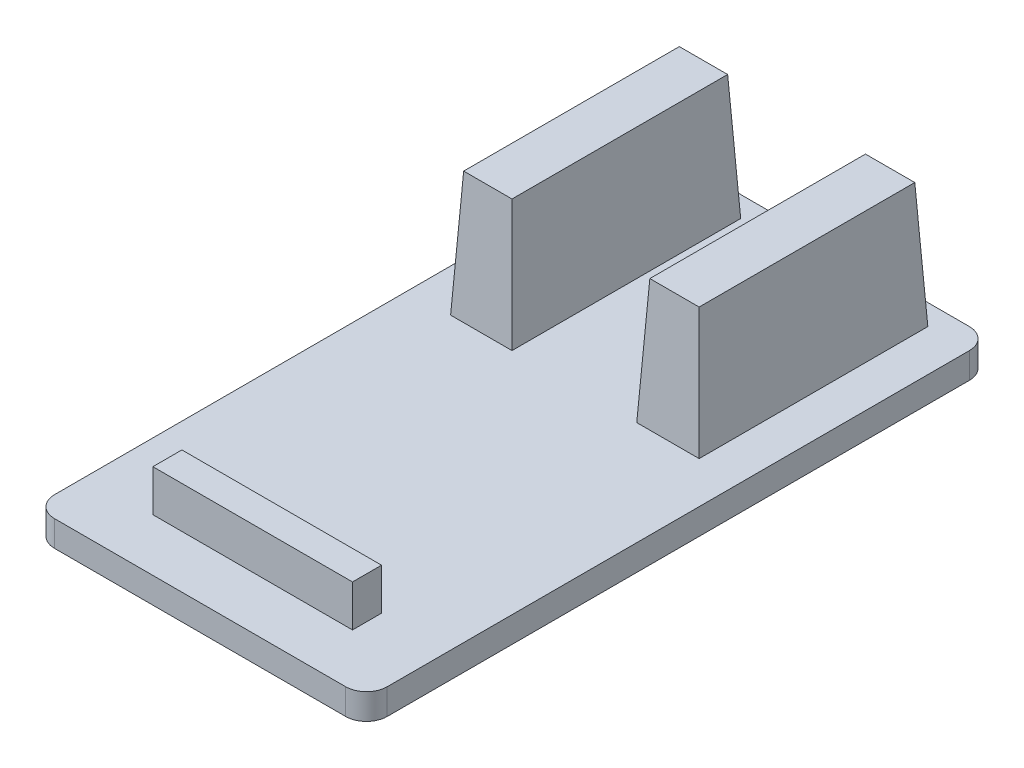
ISO-10303-21;
HEADER;
FILE_DESCRIPTION(('STEP AP214'),'2;1');
FILE_NAME('part.step','',(''),(''),'','','');
FILE_SCHEMA(('AUTOMOTIVE_DESIGN { 1 0 10303 214 1 1 1 1 }'));
ENDSEC;
DATA;
#1=APPLICATION_CONTEXT('core data for automotive mechanical design processes');
#2=APPLICATION_PROTOCOL_DEFINITION('international standard','automotive_design',2000,#1);
#3=PRODUCT_CONTEXT('',#1,'mechanical');
#4=PRODUCT('Part','Part','',(#3));
#5=PRODUCT_RELATED_PRODUCT_CATEGORY('part','',(#4));
#6=PRODUCT_DEFINITION_FORMATION('','',#4);
#7=PRODUCT_DEFINITION_CONTEXT('part definition',#1,'design');
#8=PRODUCT_DEFINITION('design','',#6,#7);
#9=PRODUCT_DEFINITION_SHAPE('','',#8);
#10=(LENGTH_UNIT() NAMED_UNIT(*) SI_UNIT(.MILLI.,.METRE.));
#11=(NAMED_UNIT(*) PLANE_ANGLE_UNIT() SI_UNIT($,.RADIAN.));
#12=(NAMED_UNIT(*) SI_UNIT($,.STERADIAN.) SOLID_ANGLE_UNIT());
#13=UNCERTAINTY_MEASURE_WITH_UNIT(LENGTH_MEASURE(1.E-05),#10,'distance_accuracy_value','');
#14=(GEOMETRIC_REPRESENTATION_CONTEXT(3) GLOBAL_UNCERTAINTY_ASSIGNED_CONTEXT((#13)) GLOBAL_UNIT_ASSIGNED_CONTEXT((#10,
#11,#12)) REPRESENTATION_CONTEXT('',''));
#15=CARTESIAN_POINT('',(0.,0.,0.));
#16=DIRECTION('',(0.,0.,1.));
#17=DIRECTION('',(1.,0.,0.));
#18=AXIS2_PLACEMENT_3D('',#15,#16,#17);
#19=CARTESIAN_POINT('',(0.,1.5748,0.));
#20=DIRECTION('',(0.,-1.,0.));
#21=DIRECTION('',(0.,0.,-1.));
#22=AXIS2_PLACEMENT_3D('',#19,#20,#21);
#23=PLANE('',#22);
#24=DIRECTION('',(0.,0.,1.));
#25=VECTOR('',#24,1.);
#26=CARTESIAN_POINT('',(2.59953863326307,1.5748,-36.83));
#27=LINE('',#26,#25);
#28=CARTESIAN_POINT('',(2.59953863326307,1.5748,-36.83));
#29=VERTEX_POINT('',#28);
#30=CARTESIAN_POINT('',(2.59953863326307,1.5748,-22.86));
#31=VERTEX_POINT('',#30);
#32=EDGE_CURVE('E318',#29,#31,#27,.T.);
#33=ORIENTED_EDGE('',*,*,#32,.F.);
#34=DIRECTION('',(-1.,0.,0.));
#35=VECTOR('',#34,1.);
#36=CARTESIAN_POINT('',(2.59953863326307,1.5748,-36.83));
#37=LINE('',#36,#35);
#38=CARTESIAN_POINT('',(6.35,1.5748,-36.83));
#39=VERTEX_POINT('',#38);
#40=EDGE_CURVE('E152',#39,#29,#37,.T.);
#41=ORIENTED_EDGE('',*,*,#40,.F.);
#42=DIRECTION('',(0.,0.,-1.));
#43=VECTOR('',#42,1.);
#44=CARTESIAN_POINT('',(6.35,1.5748,-36.83));
#45=LINE('',#44,#43);
#46=CARTESIAN_POINT('',(6.35,1.5748,-22.86));
#47=VERTEX_POINT('',#46);
#48=EDGE_CURVE('E310',#47,#39,#45,.T.);
#49=ORIENTED_EDGE('',*,*,#48,.F.);
#50=DIRECTION('',(1.,0.,0.));
#51=VECTOR('',#50,1.);
#52=CARTESIAN_POINT('',(2.59953863326307,1.5748,-22.86));
#53=LINE('',#52,#51);
#54=EDGE_CURVE('E314',#31,#47,#53,.T.);
#55=ORIENTED_EDGE('',*,*,#54,.F.);
#56=EDGE_LOOP('',(#33,#41,#49,#55));
#57=FACE_BOUND('',#56,.T.);
#58=DIRECTION('',(0.,0.,-1.));
#59=VECTOR('',#58,1.);
#60=CARTESIAN_POINT('',(20.32,1.5748,0.));
#61=LINE('',#60,#59);
#62=CARTESIAN_POINT('',(20.32,1.5748,-1.27));
#63=VERTEX_POINT('',#62);
#64=CARTESIAN_POINT('',(20.32,1.5748,-36.83));
#65=VERTEX_POINT('',#64);
#66=EDGE_CURVE('E250',#63,#65,#61,.T.);
#67=ORIENTED_EDGE('',*,*,#66,.T.);
#68=CARTESIAN_POINT('',(19.05,1.5748,-36.83));
#69=DIRECTION('',(0.,-1.,0.));
#70=DIRECTION('',(0.,0.,-1.));
#71=AXIS2_PLACEMENT_3D('',#68,#69,#70);
#72=CIRCLE('',#71,1.27);
#73=CARTESIAN_POINT('',(19.05,1.5748,-38.1));
#74=VERTEX_POINT('',#73);
#75=EDGE_CURVE('E180',#65,#74,#72,.F.);
#76=ORIENTED_EDGE('',*,*,#75,.T.);
#77=DIRECTION('',(-1.,0.,0.));
#78=VECTOR('',#77,1.);
#79=CARTESIAN_POINT('',(0.,1.5748,-38.1));
#80=LINE('',#79,#78);
#81=CARTESIAN_POINT('',(1.27,1.5748,-38.1));
#82=VERTEX_POINT('',#81);
#83=EDGE_CURVE('E228',#74,#82,#80,.T.);
#84=ORIENTED_EDGE('',*,*,#83,.T.);
#85=CARTESIAN_POINT('',(1.27,1.5748,-36.83));
#86=DIRECTION('',(0.,-1.,0.));
#87=DIRECTION('',(0.,0.,-1.));
#88=AXIS2_PLACEMENT_3D('',#85,#86,#87);
#89=CIRCLE('',#88,1.27);
#90=CARTESIAN_POINT('',(0.,1.5748,-36.83));
#91=VERTEX_POINT('',#90);
#92=EDGE_CURVE('E184',#82,#91,#89,.F.);
#93=ORIENTED_EDGE('',*,*,#92,.T.);
#94=DIRECTION('',(0.,0.,1.));
#95=VECTOR('',#94,1.);
#96=CARTESIAN_POINT('',(0.,1.5748,0.));
#97=LINE('',#96,#95);
#98=CARTESIAN_POINT('',(0.,1.5748,-1.27));
#99=VERTEX_POINT('',#98);
#100=EDGE_CURVE('E233',#91,#99,#97,.T.);
#101=ORIENTED_EDGE('',*,*,#100,.T.);
#102=CARTESIAN_POINT('',(1.27,1.5748,-1.27));
#103=DIRECTION('',(0.,-1.,0.));
#104=DIRECTION('',(0.,0.,-1.));
#105=AXIS2_PLACEMENT_3D('',#102,#103,#104);
#106=CIRCLE('',#105,1.27);
#107=CARTESIAN_POINT('',(1.27,1.5748,0.));
#108=VERTEX_POINT('',#107);
#109=EDGE_CURVE('E188',#99,#108,#106,.F.);
#110=ORIENTED_EDGE('',*,*,#109,.T.);
#111=DIRECTION('',(1.,0.,0.));
#112=VECTOR('',#111,1.);
#113=CARTESIAN_POINT('',(0.,1.5748,0.));
#114=LINE('',#113,#112);
#115=CARTESIAN_POINT('',(19.05,1.5748,0.));
#116=VERTEX_POINT('',#115);
#117=EDGE_CURVE('E254',#108,#116,#114,.T.);
#118=ORIENTED_EDGE('',*,*,#117,.T.);
#119=CARTESIAN_POINT('',(19.05,1.5748,-1.27));
#120=DIRECTION('',(0.,-1.,0.));
#121=DIRECTION('',(0.,0.,-1.));
#122=AXIS2_PLACEMENT_3D('',#119,#120,#121);
#123=CIRCLE('',#122,1.27);
#124=EDGE_CURVE('E192',#116,#63,#123,.F.);
#125=ORIENTED_EDGE('',*,*,#124,.T.);
#126=EDGE_LOOP('',(#67,#76,#84,#93,#101,#110,#118,#125));
#127=FACE_BOUND('',#126,.T.);
#128=DIRECTION('',(0.,0.,1.));
#129=VECTOR('',#128,1.);
#130=CARTESIAN_POINT('',(4.064,1.5748,-4.98408980314073));
#131=LINE('',#130,#129);
#132=CARTESIAN_POINT('',(4.064,1.5748,-4.98408980314073));
#133=VERTEX_POINT('',#132);
#134=CARTESIAN_POINT('',(4.064,1.5748,-3.21170457768581));
#135=VERTEX_POINT('',#134);
#136=EDGE_CURVE('E167',#133,#135,#131,.T.);
#137=ORIENTED_EDGE('',*,*,#136,.F.);
#138=DIRECTION('',(-1.,0.,0.));
#139=VECTOR('',#138,1.);
#140=CARTESIAN_POINT('',(4.064,1.5748,-4.98408980314073));
#141=LINE('',#140,#139);
#142=CARTESIAN_POINT('',(16.256,1.5748,-4.98408980314073));
#143=VERTEX_POINT('',#142);
#144=EDGE_CURVE('E277',#143,#133,#141,.T.);
#145=ORIENTED_EDGE('',*,*,#144,.F.);
#146=DIRECTION('',(0.,0.,-1.));
#147=VECTOR('',#146,1.);
#148=CARTESIAN_POINT('',(16.256,1.5748,-4.98408980314073));
#149=LINE('',#148,#147);
#150=CARTESIAN_POINT('',(16.256,1.5748,-3.21170457768581));
#151=VERTEX_POINT('',#150);
#152=EDGE_CURVE('E282',#151,#143,#149,.T.);
#153=ORIENTED_EDGE('',*,*,#152,.F.);
#154=DIRECTION('',(1.,0.,0.));
#155=VECTOR('',#154,1.);
#156=CARTESIAN_POINT('',(4.064,1.5748,-3.21170457768581));
#157=LINE('',#156,#155);
#158=EDGE_CURVE('E286',#135,#151,#157,.T.);
#159=ORIENTED_EDGE('',*,*,#158,.F.);
#160=EDGE_LOOP('',(#137,#145,#153,#159));
#161=FACE_BOUND('',#160,.T.);
#162=DIRECTION('',(0.,0.,1.));
#163=VECTOR('',#162,1.);
#164=CARTESIAN_POINT('',(13.97,1.5748,-36.83));
#165=LINE('',#164,#163);
#166=CARTESIAN_POINT('',(13.97,1.5748,-36.83));
#167=VERTEX_POINT('',#166);
#168=CARTESIAN_POINT('',(13.97,1.5748,-22.86));
#169=VERTEX_POINT('',#168);
#170=EDGE_CURVE('E322',#167,#169,#165,.T.);
#171=ORIENTED_EDGE('',*,*,#170,.F.);
#172=DIRECTION('',(-1.,0.,0.));
#173=VECTOR('',#172,1.);
#174=CARTESIAN_POINT('',(17.78,1.5748,-36.83));
#175=LINE('',#174,#173);
#176=CARTESIAN_POINT('',(17.78,1.5748,-36.83));
#177=VERTEX_POINT('',#176);
#178=EDGE_CURVE('E110',#177,#167,#175,.T.);
#179=ORIENTED_EDGE('',*,*,#178,.F.);
#180=DIRECTION('',(0.,0.,-1.));
#181=VECTOR('',#180,1.);
#182=CARTESIAN_POINT('',(17.78,1.5748,-36.83));
#183=LINE('',#182,#181);
#184=CARTESIAN_POINT('',(17.78,1.5748,-22.86));
#185=VERTEX_POINT('',#184);
#186=EDGE_CURVE('E122',#185,#177,#183,.T.);
#187=ORIENTED_EDGE('',*,*,#186,.F.);
#188=DIRECTION('',(1.,0.,0.));
#189=VECTOR('',#188,1.);
#190=CARTESIAN_POINT('',(17.78,1.5748,-22.86));
#191=LINE('',#190,#189);
#192=EDGE_CURVE('E63',#169,#185,#191,.T.);
#193=ORIENTED_EDGE('',*,*,#192,.F.);
#194=EDGE_LOOP('',(#171,#179,#187,#193));
#195=FACE_BOUND('',#194,.T.);
#196=ADVANCED_FACE('F43',(#57,#127,#161,#195),#23,.F.);
#197=CARTESIAN_POINT('',(0.,1.5748,0.));
#198=DIRECTION('',(1.,0.,0.));
#199=DIRECTION('',(0.,0.,-1.));
#200=AXIS2_PLACEMENT_3D('',#197,#198,#199);
#201=PLANE('',#200);
#202=ORIENTED_EDGE('',*,*,#100,.F.);
#203=DIRECTION('',(0.,-1.,0.));
#204=VECTOR('',#203,1.);
#205=CARTESIAN_POINT('',(0.,1.5748,-36.83));
#206=LINE('',#205,#204);
#207=CARTESIAN_POINT('',(0.,0.,-36.83));
#208=VERTEX_POINT('',#207);
#209=EDGE_CURVE('E172',#91,#208,#206,.T.);
#210=ORIENTED_EDGE('',*,*,#209,.T.);
#211=DIRECTION('',(0.,0.,1.));
#212=VECTOR('',#211,1.);
#213=CARTESIAN_POINT('',(0.,0.,0.));
#214=LINE('',#213,#212);
#215=CARTESIAN_POINT('',(0.,0.,-1.27));
#216=VERTEX_POINT('',#215);
#217=EDGE_CURVE('E242',#208,#216,#214,.T.);
#218=ORIENTED_EDGE('',*,*,#217,.T.);
#219=DIRECTION('',(0.,-1.,0.));
#220=VECTOR('',#219,1.);
#221=CARTESIAN_POINT('',(0.,1.5748,-1.27));
#222=LINE('',#221,#220);
#223=EDGE_CURVE('E176',#216,#99,#222,.F.);
#224=ORIENTED_EDGE('',*,*,#223,.T.);
#225=EDGE_LOOP('',(#202,#210,#218,#224));
#226=FACE_BOUND('',#225,.T.);
#227=ADVANCED_FACE('F430',(#226),#201,.F.);
#228=CARTESIAN_POINT('',(0.,1.5748,0.));
#229=DIRECTION('',(0.,0.,-1.));
#230=DIRECTION('',(-1.,0.,0.));
#231=AXIS2_PLACEMENT_3D('',#228,#229,#230);
#232=PLANE('',#231);
#233=ORIENTED_EDGE('',*,*,#117,.F.);
#234=DIRECTION('',(0.,-1.,0.));
#235=VECTOR('',#234,1.);
#236=CARTESIAN_POINT('',(1.27,1.5748,0.));
#237=LINE('',#236,#235);
#238=CARTESIAN_POINT('',(1.27,0.,0.));
#239=VERTEX_POINT('',#238);
#240=EDGE_CURVE('E11',#108,#239,#237,.T.);
#241=ORIENTED_EDGE('',*,*,#240,.T.);
#242=DIRECTION('',(1.,0.,0.));
#243=VECTOR('',#242,1.);
#244=CARTESIAN_POINT('',(0.,0.,0.));
#245=LINE('',#244,#243);
#246=CARTESIAN_POINT('',(19.05,0.,0.));
#247=VERTEX_POINT('',#246);
#248=EDGE_CURVE('E238',#239,#247,#245,.T.);
#249=ORIENTED_EDGE('',*,*,#248,.T.);
#250=DIRECTION('',(0.,-1.,0.));
#251=VECTOR('',#250,1.);
#252=CARTESIAN_POINT('',(19.05,1.5748,0.));
#253=LINE('',#252,#251);
#254=EDGE_CURVE('E54',#247,#116,#253,.F.);
#255=ORIENTED_EDGE('',*,*,#254,.T.);
#256=EDGE_LOOP('',(#233,#241,#249,#255));
#257=FACE_BOUND('',#256,.T.);
#258=ADVANCED_FACE('F437',(#257),#232,.F.);
#259=CARTESIAN_POINT('',(20.32,1.5748,0.));
#260=DIRECTION('',(-1.,0.,0.));
#261=DIRECTION('',(0.,0.,1.));
#262=AXIS2_PLACEMENT_3D('',#259,#260,#261);
#263=PLANE('',#262);
#264=DIRECTION('',(0.,0.,-1.));
#265=VECTOR('',#264,1.);
#266=CARTESIAN_POINT('',(20.32,0.,0.));
#267=LINE('',#266,#265);
#268=CARTESIAN_POINT('',(20.32,0.,-1.27));
#269=VERTEX_POINT('',#268);
#270=CARTESIAN_POINT('',(20.32,0.,-36.83));
#271=VERTEX_POINT('',#270);
#272=EDGE_CURVE('E234',#269,#271,#267,.T.);
#273=ORIENTED_EDGE('',*,*,#272,.T.);
#274=DIRECTION('',(0.,-1.,0.));
#275=VECTOR('',#274,1.);
#276=CARTESIAN_POINT('',(20.32,1.5748,-36.83));
#277=LINE('',#276,#275);
#278=EDGE_CURVE('E196',#271,#65,#277,.F.);
#279=ORIENTED_EDGE('',*,*,#278,.T.);
#280=ORIENTED_EDGE('',*,*,#66,.F.);
#281=DIRECTION('',(0.,-1.,0.));
#282=VECTOR('',#281,1.);
#283=CARTESIAN_POINT('',(20.32,1.5748,-1.27));
#284=LINE('',#283,#282);
#285=EDGE_CURVE('E200',#63,#269,#284,.T.);
#286=ORIENTED_EDGE('',*,*,#285,.T.);
#287=EDGE_LOOP('',(#273,#279,#280,#286));
#288=FACE_BOUND('',#287,.T.);
#289=ADVANCED_FACE('F452',(#288),#263,.F.);
#290=CARTESIAN_POINT('',(0.,1.5748,-38.1));
#291=DIRECTION('',(0.,0.,1.));
#292=DIRECTION('',(1.,0.,0.));
#293=AXIS2_PLACEMENT_3D('',#290,#291,#292);
#294=PLANE('',#293);
#295=ORIENTED_EDGE('',*,*,#83,.F.);
#296=DIRECTION('',(0.,-1.,0.));
#297=VECTOR('',#296,1.);
#298=CARTESIAN_POINT('',(19.05,1.5748,-38.1));
#299=LINE('',#298,#297);
#300=CARTESIAN_POINT('',(19.05,0.,-38.1));
#301=VERTEX_POINT('',#300);
#302=EDGE_CURVE('E220',#74,#301,#299,.T.);
#303=ORIENTED_EDGE('',*,*,#302,.T.);
#304=DIRECTION('',(-1.,0.,0.));
#305=VECTOR('',#304,1.);
#306=CARTESIAN_POINT('',(0.,0.,-38.1));
#307=LINE('',#306,#305);
#308=CARTESIAN_POINT('',(1.27,0.,-38.1));
#309=VERTEX_POINT('',#308);
#310=EDGE_CURVE('E229',#301,#309,#307,.T.);
#311=ORIENTED_EDGE('',*,*,#310,.T.);
#312=DIRECTION('',(0.,-1.,0.));
#313=VECTOR('',#312,1.);
#314=CARTESIAN_POINT('',(1.27,1.5748,-38.1));
#315=LINE('',#314,#313);
#316=EDGE_CURVE('E224',#309,#82,#315,.F.);
#317=ORIENTED_EDGE('',*,*,#316,.T.);
#318=EDGE_LOOP('',(#295,#303,#311,#317));
#319=FACE_BOUND('',#318,.T.);
#320=ADVANCED_FACE('F448',(#319),#294,.F.);
#321=CARTESIAN_POINT('',(0.,0.,0.));
#322=DIRECTION('',(0.,-1.,0.));
#323=DIRECTION('',(0.,0.,-1.));
#324=AXIS2_PLACEMENT_3D('',#321,#322,#323);
#325=PLANE('',#324);
#326=ORIENTED_EDGE('',*,*,#310,.F.);
#327=CARTESIAN_POINT('',(19.05,0.,-36.83));
#328=DIRECTION('',(0.,-1.,0.));
#329=DIRECTION('',(0.,0.,-1.));
#330=AXIS2_PLACEMENT_3D('',#327,#328,#329);
#331=CIRCLE('',#330,1.27);
#332=EDGE_CURVE('E204',#301,#271,#331,.T.);
#333=ORIENTED_EDGE('',*,*,#332,.T.);
#334=ORIENTED_EDGE('',*,*,#272,.F.);
#335=CARTESIAN_POINT('',(19.05,0.,-1.27));
#336=DIRECTION('',(0.,-1.,0.));
#337=DIRECTION('',(0.,0.,-1.));
#338=AXIS2_PLACEMENT_3D('',#335,#336,#337);
#339=CIRCLE('',#338,1.27);
#340=EDGE_CURVE('E216',#269,#247,#339,.T.);
#341=ORIENTED_EDGE('',*,*,#340,.T.);
#342=ORIENTED_EDGE('',*,*,#248,.F.);
#343=CARTESIAN_POINT('',(1.27,0.,-1.27));
#344=DIRECTION('',(0.,-1.,0.));
#345=DIRECTION('',(0.,0.,-1.));
#346=AXIS2_PLACEMENT_3D('',#343,#344,#345);
#347=CIRCLE('',#346,1.27);
#348=EDGE_CURVE('E212',#239,#216,#347,.T.);
#349=ORIENTED_EDGE('',*,*,#348,.T.);
#350=ORIENTED_EDGE('',*,*,#217,.F.);
#351=CARTESIAN_POINT('',(1.27,0.,-36.83));
#352=DIRECTION('',(0.,-1.,0.));
#353=DIRECTION('',(0.,0.,-1.));
#354=AXIS2_PLACEMENT_3D('',#351,#352,#353);
#355=CIRCLE('',#354,1.27);
#356=EDGE_CURVE('E208',#208,#309,#355,.T.);
#357=ORIENTED_EDGE('',*,*,#356,.T.);
#358=EDGE_LOOP('',(#326,#333,#334,#341,#342,#349,#350,#357));
#359=FACE_BOUND('',#358,.T.);
#360=ADVANCED_FACE('F444',(#359),#325,.T.);
#361=CARTESIAN_POINT('',(19.05,1.5748,-36.83));
#362=DIRECTION('',(0.,-1.,0.));
#363=DIRECTION('',(0.,0.,-1.));
#364=AXIS2_PLACEMENT_3D('',#361,#362,#363);
#365=CYLINDRICAL_SURFACE('',#364,1.27);
#366=ORIENTED_EDGE('',*,*,#75,.F.);
#367=ORIENTED_EDGE('',*,*,#278,.F.);
#368=ORIENTED_EDGE('',*,*,#332,.F.);
#369=ORIENTED_EDGE('',*,*,#302,.F.);
#370=EDGE_LOOP('',(#366,#367,#368,#369));
#371=FACE_BOUND('',#370,.T.);
#372=ADVANCED_FACE('F447',(#371),#365,.T.);
#373=CARTESIAN_POINT('',(1.27,1.5748,-36.83));
#374=DIRECTION('',(0.,-1.,0.));
#375=DIRECTION('',(0.,0.,-1.));
#376=AXIS2_PLACEMENT_3D('',#373,#374,#375);
#377=CYLINDRICAL_SURFACE('',#376,1.27);
#378=ORIENTED_EDGE('',*,*,#92,.F.);
#379=ORIENTED_EDGE('',*,*,#316,.F.);
#380=ORIENTED_EDGE('',*,*,#356,.F.);
#381=ORIENTED_EDGE('',*,*,#209,.F.);
#382=EDGE_LOOP('',(#378,#379,#380,#381));
#383=FACE_BOUND('',#382,.T.);
#384=ADVANCED_FACE('F462',(#383),#377,.T.);
#385=CARTESIAN_POINT('',(1.27,1.5748,-1.27));
#386=DIRECTION('',(0.,-1.,0.));
#387=DIRECTION('',(0.,0.,-1.));
#388=AXIS2_PLACEMENT_3D('',#385,#386,#387);
#389=CYLINDRICAL_SURFACE('',#388,1.27);
#390=ORIENTED_EDGE('',*,*,#109,.F.);
#391=ORIENTED_EDGE('',*,*,#223,.F.);
#392=ORIENTED_EDGE('',*,*,#348,.F.);
#393=ORIENTED_EDGE('',*,*,#240,.F.);
#394=EDGE_LOOP('',(#390,#391,#392,#393));
#395=FACE_BOUND('',#394,.T.);
#396=ADVANCED_FACE('F466',(#395),#389,.T.);
#397=CARTESIAN_POINT('',(19.05,1.5748,-1.27));
#398=DIRECTION('',(0.,-1.,0.));
#399=DIRECTION('',(0.,0.,-1.));
#400=AXIS2_PLACEMENT_3D('',#397,#398,#399);
#401=CYLINDRICAL_SURFACE('',#400,1.27);
#402=ORIENTED_EDGE('',*,*,#124,.F.);
#403=ORIENTED_EDGE('',*,*,#254,.F.);
#404=ORIENTED_EDGE('',*,*,#340,.F.);
#405=ORIENTED_EDGE('',*,*,#285,.F.);
#406=EDGE_LOOP('',(#402,#403,#404,#405));
#407=FACE_BOUND('',#406,.T.);
#408=ADVANCED_FACE('F470',(#407),#401,.T.);
#409=CARTESIAN_POINT('',(4.064,4.1148,-4.98408980314073));
#410=DIRECTION('',(1.,0.,0.));
#411=DIRECTION('',(0.,0.,-1.));
#412=AXIS2_PLACEMENT_3D('',#409,#410,#411);
#413=PLANE('',#412);
#414=ORIENTED_EDGE('',*,*,#136,.T.);
#415=DIRECTION('',(0.,-1.,0.));
#416=VECTOR('',#415,1.);
#417=CARTESIAN_POINT('',(4.064,4.1148,-3.21170457768581));
#418=LINE('',#417,#416);
#419=CARTESIAN_POINT('',(4.064,4.1148,-3.21170457768581));
#420=VERTEX_POINT('',#419);
#421=EDGE_CURVE('E246',#420,#135,#418,.T.);
#422=ORIENTED_EDGE('',*,*,#421,.F.);
#423=DIRECTION('',(0.,0.,1.));
#424=VECTOR('',#423,1.);
#425=CARTESIAN_POINT('',(4.064,4.1148,-4.98408980314073));
#426=LINE('',#425,#424);
#427=CARTESIAN_POINT('',(4.064,4.1148,-4.98408980314073));
#428=VERTEX_POINT('',#427);
#429=EDGE_CURVE('E281',#428,#420,#426,.T.);
#430=ORIENTED_EDGE('',*,*,#429,.F.);
#431=DIRECTION('',(0.,-1.,0.));
#432=VECTOR('',#431,1.);
#433=CARTESIAN_POINT('',(4.064,4.1148,-4.98408980314073));
#434=LINE('',#433,#432);
#435=EDGE_CURVE('E272',#428,#133,#434,.T.);
#436=ORIENTED_EDGE('',*,*,#435,.T.);
#437=EDGE_LOOP('',(#414,#422,#430,#436));
#438=FACE_BOUND('',#437,.T.);
#439=ADVANCED_FACE('F442',(#438),#413,.F.);
#440=CARTESIAN_POINT('',(4.064,4.1148,-3.21170457768581));
#441=DIRECTION('',(0.,0.,-1.));
#442=DIRECTION('',(-1.,0.,0.));
#443=AXIS2_PLACEMENT_3D('',#440,#441,#442);
#444=PLANE('',#443);
#445=ORIENTED_EDGE('',*,*,#158,.T.);
#446=DIRECTION('',(0.,-1.,0.));
#447=VECTOR('',#446,1.);
#448=CARTESIAN_POINT('',(16.256,4.1148,-3.21170457768581));
#449=LINE('',#448,#447);
#450=CARTESIAN_POINT('',(16.256,4.1148,-3.21170457768581));
#451=VERTEX_POINT('',#450);
#452=EDGE_CURVE('E264',#451,#151,#449,.T.);
#453=ORIENTED_EDGE('',*,*,#452,.F.);
#454=DIRECTION('',(1.,0.,0.));
#455=VECTOR('',#454,1.);
#456=CARTESIAN_POINT('',(4.064,4.1148,-3.21170457768581));
#457=LINE('',#456,#455);
#458=EDGE_CURVE('E300',#420,#451,#457,.T.);
#459=ORIENTED_EDGE('',*,*,#458,.F.);
#460=ORIENTED_EDGE('',*,*,#421,.T.);
#461=EDGE_LOOP('',(#445,#453,#459,#460));
#462=FACE_BOUND('',#461,.T.);
#463=ADVANCED_FACE('F554',(#462),#444,.F.);
#464=CARTESIAN_POINT('',(16.256,4.1148,-4.98408980314073));
#465=DIRECTION('',(-1.,0.,0.));
#466=DIRECTION('',(0.,0.,1.));
#467=AXIS2_PLACEMENT_3D('',#464,#465,#466);
#468=PLANE('',#467);
#469=ORIENTED_EDGE('',*,*,#152,.T.);
#470=DIRECTION('',(0.,-1.,0.));
#471=VECTOR('',#470,1.);
#472=CARTESIAN_POINT('',(16.256,4.1148,-4.98408980314073));
#473=LINE('',#472,#471);
#474=CARTESIAN_POINT('',(16.256,4.1148,-4.98408980314073));
#475=VERTEX_POINT('',#474);
#476=EDGE_CURVE('E268',#475,#143,#473,.T.);
#477=ORIENTED_EDGE('',*,*,#476,.F.);
#478=DIRECTION('',(0.,0.,-1.));
#479=VECTOR('',#478,1.);
#480=CARTESIAN_POINT('',(16.256,4.1148,-4.98408980314073));
#481=LINE('',#480,#479);
#482=EDGE_CURVE('E296',#451,#475,#481,.T.);
#483=ORIENTED_EDGE('',*,*,#482,.F.);
#484=ORIENTED_EDGE('',*,*,#452,.T.);
#485=EDGE_LOOP('',(#469,#477,#483,#484));
#486=FACE_BOUND('',#485,.T.);
#487=ADVANCED_FACE('F546',(#486),#468,.F.);
#488=CARTESIAN_POINT('',(4.064,4.1148,-4.98408980314073));
#489=DIRECTION('',(0.,0.,1.));
#490=DIRECTION('',(1.,0.,0.));
#491=AXIS2_PLACEMENT_3D('',#488,#489,#490);
#492=PLANE('',#491);
#493=ORIENTED_EDGE('',*,*,#144,.T.);
#494=ORIENTED_EDGE('',*,*,#435,.F.);
#495=DIRECTION('',(-1.,0.,0.));
#496=VECTOR('',#495,1.);
#497=CARTESIAN_POINT('',(4.064,4.1148,-4.98408980314073));
#498=LINE('',#497,#496);
#499=EDGE_CURVE('E276',#475,#428,#498,.T.);
#500=ORIENTED_EDGE('',*,*,#499,.F.);
#501=ORIENTED_EDGE('',*,*,#476,.T.);
#502=EDGE_LOOP('',(#493,#494,#500,#501));
#503=FACE_BOUND('',#502,.T.);
#504=ADVANCED_FACE('F539',(#503),#492,.F.);
#505=CARTESIAN_POINT('',(0.,4.1148,0.));
#506=DIRECTION('',(0.,1.,0.));
#507=DIRECTION('',(0.,0.,1.));
#508=AXIS2_PLACEMENT_3D('',#505,#506,#507);
#509=PLANE('',#508);
#510=ORIENTED_EDGE('',*,*,#429,.T.);
#511=ORIENTED_EDGE('',*,*,#458,.T.);
#512=ORIENTED_EDGE('',*,*,#482,.T.);
#513=ORIENTED_EDGE('',*,*,#499,.T.);
#514=EDGE_LOOP('',(#510,#511,#512,#513));
#515=FACE_BOUND('',#514,.T.);
#516=ADVANCED_FACE('F476',(#515),#509,.T.);
#517=CARTESIAN_POINT('',(2.59953863326307,1.5748,-36.83));
#518=DIRECTION('',(-0.998629534754574,0.0523359562429439,0.));
#519=DIRECTION('',(-0.0523359562429439,-0.998629534754574,0.));
#520=AXIS2_PLACEMENT_3D('',#517,#518,#519);
#521=PLANE('',#520);
#522=ORIENTED_EDGE('',*,*,#32,.T.);
#523=DIRECTION('',(-0.052264427688714,-0.997264688634237,0.052264427688714));
#524=VECTOR('',#523,1.);
#525=CARTESIAN_POINT('',(2.59953863326307,1.5748,-22.86));
#526=LINE('',#525,#524);
#527=CARTESIAN_POINT('',(2.99888591139984,9.1948,-23.2593472781368));
#528=VERTEX_POINT('',#527);
#529=EDGE_CURVE('E157',#528,#31,#526,.T.);
#530=ORIENTED_EDGE('',*,*,#529,.F.);
#531=DIRECTION('',(0.,0.,-1.));
#532=VECTOR('',#531,1.);
#533=CARTESIAN_POINT('',(2.99888591139984,9.1948,-36.83));
#534=LINE('',#533,#532);
#535=CARTESIAN_POINT('',(2.99888591139984,9.1948,-36.4306527218632));
#536=VERTEX_POINT('',#535);
#537=EDGE_CURVE('E148',#536,#528,#534,.F.);
#538=ORIENTED_EDGE('',*,*,#537,.F.);
#539=DIRECTION('',(-0.052264427688714,-0.997264688634237,-0.052264427688714));
#540=VECTOR('',#539,1.);
#541=CARTESIAN_POINT('',(2.59953863326307,1.5748,-36.83));
#542=LINE('',#541,#540);
#543=EDGE_CURVE('E141',#536,#29,#542,.T.);
#544=ORIENTED_EDGE('',*,*,#543,.T.);
#545=EDGE_LOOP('',(#522,#530,#538,#544));
#546=FACE_BOUND('',#545,.T.);
#547=ADVANCED_FACE('F408',(#546),#521,.T.);
#548=CARTESIAN_POINT('',(2.59953863326307,1.5748,-22.86));
#549=DIRECTION('',(0.,0.0523359562429439,0.998629534754574));
#550=DIRECTION('',(0.,-0.998629534754574,0.0523359562429439));
#551=AXIS2_PLACEMENT_3D('',#548,#549,#550);
#552=PLANE('',#551);
#553=ORIENTED_EDGE('',*,*,#54,.T.);
#554=DIRECTION('',(0.052264427688714,-0.997264688634237,0.052264427688714));
#555=VECTOR('',#554,1.);
#556=CARTESIAN_POINT('',(6.31183996148925,2.30293691083268,-22.8981600385108));
#557=LINE('',#556,#555);
#558=CARTESIAN_POINT('',(5.95065272186323,9.1948,-23.2593472781368));
#559=VERTEX_POINT('',#558);
#560=EDGE_CURVE('E153',#559,#47,#557,.T.);
#561=ORIENTED_EDGE('',*,*,#560,.F.);
#562=DIRECTION('',(-1.,0.,0.));
#563=VECTOR('',#562,1.);
#564=CARTESIAN_POINT('',(2.59953863326307,9.1948,-23.2593472781368));
#565=LINE('',#564,#563);
#566=EDGE_CURVE('E145',#528,#559,#565,.F.);
#567=ORIENTED_EDGE('',*,*,#566,.F.);
#568=ORIENTED_EDGE('',*,*,#529,.T.);
#569=EDGE_LOOP('',(#553,#561,#567,#568));
#570=FACE_BOUND('',#569,.T.);
#571=ADVANCED_FACE('F405',(#570),#552,.T.);
#572=CARTESIAN_POINT('',(6.35,1.5748,-36.83));
#573=DIRECTION('',(0.998629534754574,0.0523359562429439,0.));
#574=DIRECTION('',(-0.0523359562429439,0.998629534754574,0.));
#575=AXIS2_PLACEMENT_3D('',#572,#573,#574);
#576=PLANE('',#575);
#577=ORIENTED_EDGE('',*,*,#48,.T.);
#578=DIRECTION('',(0.052264427688714,-0.997264688634237,-0.052264427688714));
#579=VECTOR('',#578,1.);
#580=CARTESIAN_POINT('',(6.33975535073817,1.77027955288283,-36.8197553507382));
#581=LINE('',#580,#579);
#582=CARTESIAN_POINT('',(5.95065272186323,9.1948,-36.4306527218632));
#583=VERTEX_POINT('',#582);
#584=EDGE_CURVE('E158',#583,#39,#581,.T.);
#585=ORIENTED_EDGE('',*,*,#584,.F.);
#586=DIRECTION('',(0.,0.,1.));
#587=VECTOR('',#586,1.);
#588=CARTESIAN_POINT('',(5.95065272186323,9.1948,-36.83));
#589=LINE('',#588,#587);
#590=EDGE_CURVE('E142',#559,#583,#589,.F.);
#591=ORIENTED_EDGE('',*,*,#590,.F.);
#592=ORIENTED_EDGE('',*,*,#560,.T.);
#593=EDGE_LOOP('',(#577,#585,#591,#592));
#594=FACE_BOUND('',#593,.T.);
#595=ADVANCED_FACE('F415',(#594),#576,.T.);
#596=CARTESIAN_POINT('',(2.59953863326307,1.5748,-36.83));
#597=DIRECTION('',(0.,0.0523359562429439,-0.998629534754574));
#598=DIRECTION('',(0.,0.998629534754574,0.0523359562429439));
#599=AXIS2_PLACEMENT_3D('',#596,#597,#598);
#600=PLANE('',#599);
#601=ORIENTED_EDGE('',*,*,#40,.T.);
#602=ORIENTED_EDGE('',*,*,#543,.F.);
#603=DIRECTION('',(1.,0.,0.));
#604=VECTOR('',#603,1.);
#605=CARTESIAN_POINT('',(2.59953863326307,9.1948,-36.4306527218632));
#606=LINE('',#605,#604);
#607=EDGE_CURVE('E138',#583,#536,#606,.F.);
#608=ORIENTED_EDGE('',*,*,#607,.F.);
#609=ORIENTED_EDGE('',*,*,#584,.T.);
#610=EDGE_LOOP('',(#601,#602,#608,#609));
#611=FACE_BOUND('',#610,.T.);
#612=ADVANCED_FACE('F412',(#611),#600,.T.);
#613=CARTESIAN_POINT('',(0.,9.1948,0.));
#614=DIRECTION('',(0.,1.,0.));
#615=DIRECTION('',(0.,0.,1.));
#616=AXIS2_PLACEMENT_3D('',#613,#614,#615);
#617=PLANE('',#616);
#618=ORIENTED_EDGE('',*,*,#537,.T.);
#619=ORIENTED_EDGE('',*,*,#566,.T.);
#620=ORIENTED_EDGE('',*,*,#590,.T.);
#621=ORIENTED_EDGE('',*,*,#607,.T.);
#622=EDGE_LOOP('',(#618,#619,#620,#621));
#623=FACE_BOUND('',#622,.T.);
#624=ADVANCED_FACE('F418',(#623),#617,.T.);
#625=CARTESIAN_POINT('',(13.97,1.5748,-36.83));
#626=DIRECTION('',(-0.998629534754574,0.0523359562429439,0.));
#627=DIRECTION('',(-0.0523359562429439,-0.998629534754574,0.));
#628=AXIS2_PLACEMENT_3D('',#625,#626,#627);
#629=PLANE('',#628);
#630=ORIENTED_EDGE('',*,*,#170,.T.);
#631=DIRECTION('',(-0.052264427688714,-0.997264688634237,0.052264427688714));
#632=VECTOR('',#631,1.);
#633=CARTESIAN_POINT('',(13.9804072832302,1.77338279386346,-22.8704072832302));
#634=LINE('',#633,#632);
#635=CARTESIAN_POINT('',(14.3693472781368,9.1948,-23.2593472781368));
#636=VERTEX_POINT('',#635);
#637=EDGE_CURVE('E117',#636,#169,#634,.T.);
#638=ORIENTED_EDGE('',*,*,#637,.F.);
#639=DIRECTION('',(0.,0.,-1.));
#640=VECTOR('',#639,1.);
#641=CARTESIAN_POINT('',(14.3693472781368,9.1948,0.));
#642=LINE('',#641,#640);
#643=CARTESIAN_POINT('',(14.3693472781368,9.1948,-36.4306527218632));
#644=VERTEX_POINT('',#643);
#645=EDGE_CURVE('E47',#644,#636,#642,.F.);
#646=ORIENTED_EDGE('',*,*,#645,.F.);
#647=DIRECTION('',(-0.052264427688714,-0.997264688634237,-0.052264427688714));
#648=VECTOR('',#647,1.);
#649=CARTESIAN_POINT('',(13.97,1.5748,-36.83));
#650=LINE('',#649,#648);
#651=EDGE_CURVE('E104',#644,#167,#650,.T.);
#652=ORIENTED_EDGE('',*,*,#651,.T.);
#653=EDGE_LOOP('',(#630,#638,#646,#652));
#654=FACE_BOUND('',#653,.T.);
#655=ADVANCED_FACE('F116',(#654),#629,.T.);
#656=CARTESIAN_POINT('',(17.78,1.5748,-22.86));
#657=DIRECTION('',(0.,0.0523359562429439,0.998629534754574));
#658=DIRECTION('',(0.,-0.998629534754574,0.0523359562429439));
#659=AXIS2_PLACEMENT_3D('',#656,#657,#658);
#660=PLANE('',#659);
#661=ORIENTED_EDGE('',*,*,#192,.T.);
#662=DIRECTION('',(0.0522644276887139,-0.997264688634237,0.052264427688714));
#663=VECTOR('',#662,1.);
#664=CARTESIAN_POINT('',(17.7418399614892,2.30293691083268,-22.8981600385108));
#665=LINE('',#664,#663);
#666=CARTESIAN_POINT('',(17.3806527218632,9.1948,-23.2593472781368));
#667=VERTEX_POINT('',#666);
#668=EDGE_CURVE('E131',#667,#185,#665,.T.);
#669=ORIENTED_EDGE('',*,*,#668,.F.);
#670=DIRECTION('',(-1.,0.,0.));
#671=VECTOR('',#670,1.);
#672=CARTESIAN_POINT('',(0.,9.1948,-23.2593472781368));
#673=LINE('',#672,#671);
#674=EDGE_CURVE('E119',#636,#667,#673,.F.);
#675=ORIENTED_EDGE('',*,*,#674,.F.);
#676=ORIENTED_EDGE('',*,*,#637,.T.);
#677=EDGE_LOOP('',(#661,#669,#675,#676));
#678=FACE_BOUND('',#677,.T.);
#679=ADVANCED_FACE('F332',(#678),#660,.T.);
#680=CARTESIAN_POINT('',(17.78,1.5748,-36.83));
#681=DIRECTION('',(0.998629534754574,0.0523359562429439,0.));
#682=DIRECTION('',(-0.0523359562429439,0.998629534754574,0.));
#683=AXIS2_PLACEMENT_3D('',#680,#681,#682);
#684=PLANE('',#683);
#685=ORIENTED_EDGE('',*,*,#186,.T.);
#686=DIRECTION('',(0.052264427688714,-0.997264688634237,-0.052264427688714));
#687=VECTOR('',#686,1.);
#688=CARTESIAN_POINT('',(17.78,1.5748,-36.83));
#689=LINE('',#688,#687);
#690=CARTESIAN_POINT('',(17.3806527218632,9.1948,-36.4306527218632));
#691=VERTEX_POINT('',#690);
#692=EDGE_CURVE('E114',#691,#177,#689,.T.);
#693=ORIENTED_EDGE('',*,*,#692,.F.);
#694=DIRECTION('',(0.,0.,1.));
#695=VECTOR('',#694,1.);
#696=CARTESIAN_POINT('',(17.3806527218632,9.1948,0.));
#697=LINE('',#696,#695);
#698=EDGE_CURVE('E99',#667,#691,#697,.F.);
#699=ORIENTED_EDGE('',*,*,#698,.F.);
#700=ORIENTED_EDGE('',*,*,#668,.T.);
#701=EDGE_LOOP('',(#685,#693,#699,#700));
#702=FACE_BOUND('',#701,.T.);
#703=ADVANCED_FACE('F45',(#702),#684,.T.);
#704=CARTESIAN_POINT('',(17.78,1.5748,-36.83));
#705=DIRECTION('',(0.,0.0523359562429439,-0.998629534754574));
#706=DIRECTION('',(0.,0.998629534754574,0.0523359562429439));
#707=AXIS2_PLACEMENT_3D('',#704,#705,#706);
#708=PLANE('',#707);
#709=ORIENTED_EDGE('',*,*,#178,.T.);
#710=ORIENTED_EDGE('',*,*,#651,.F.);
#711=DIRECTION('',(1.,0.,0.));
#712=VECTOR('',#711,1.);
#713=CARTESIAN_POINT('',(0.,9.1948,-36.4306527218632));
#714=LINE('',#713,#712);
#715=EDGE_CURVE('E93',#691,#644,#714,.F.);
#716=ORIENTED_EDGE('',*,*,#715,.F.);
#717=ORIENTED_EDGE('',*,*,#692,.T.);
#718=EDGE_LOOP('',(#709,#710,#716,#717));
#719=FACE_BOUND('',#718,.T.);
#720=ADVANCED_FACE('F107',(#719),#708,.T.);
#721=CARTESIAN_POINT('',(0.,9.1948,0.));
#722=DIRECTION('',(0.,-1.,0.));
#723=DIRECTION('',(0.,0.,-1.));
#724=AXIS2_PLACEMENT_3D('',#721,#722,#723);
#725=PLANE('',#724);
#726=ORIENTED_EDGE('',*,*,#645,.T.);
#727=ORIENTED_EDGE('',*,*,#674,.T.);
#728=ORIENTED_EDGE('',*,*,#698,.T.);
#729=ORIENTED_EDGE('',*,*,#715,.T.);
#730=EDGE_LOOP('',(#726,#727,#728,#729));
#731=FACE_BOUND('',#730,.T.);
#732=ADVANCED_FACE('F95',(#731),#725,.F.);
#733=CLOSED_SHELL('',(#196,#227,#258,#289,#320,#360,#372,#384,#396,#408,#439,#463,#487,#504,
#516,#547,#571,#595,#612,#624,#655,#679,#703,#720,#732));
#734=MANIFOLD_SOLID_BREP('B2',#733);
#735=ADVANCED_BREP_SHAPE_REPRESENTATION('',(#18,#734),#14);
#736=SHAPE_DEFINITION_REPRESENTATION(#9,#735);
ENDSEC;
END-ISO-10303-21;
